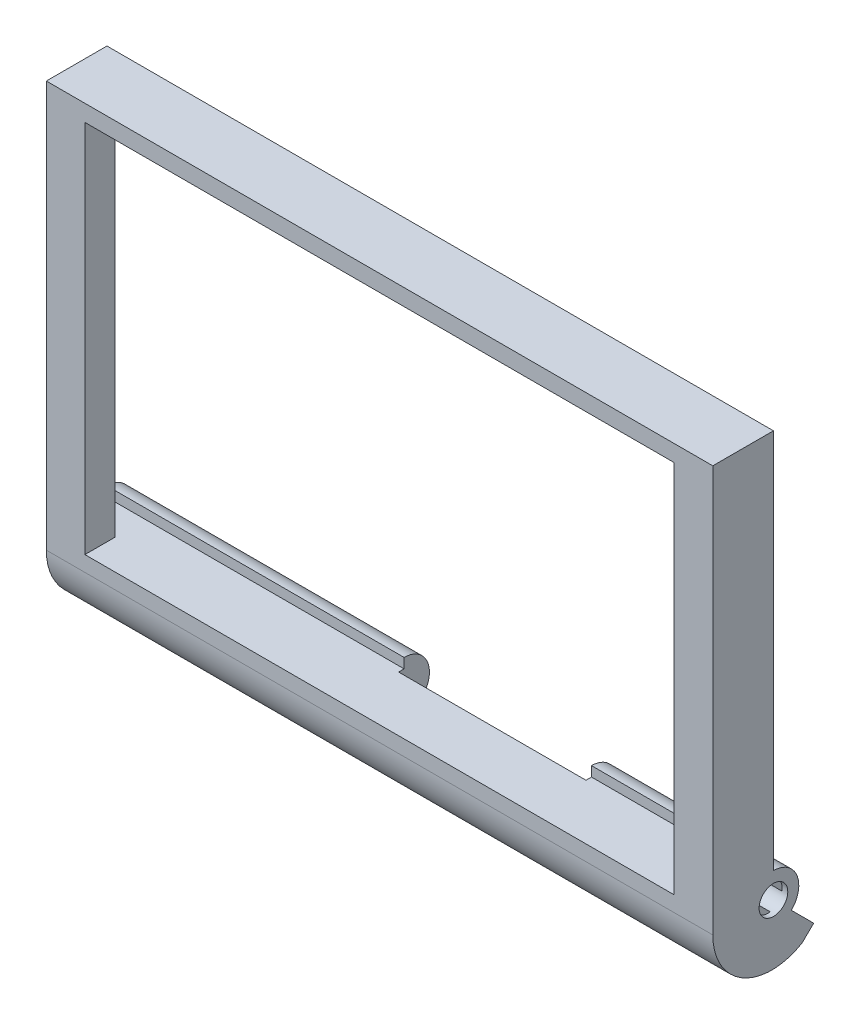
ISO-10303-21;
HEADER;
FILE_DESCRIPTION(('STEP AP214'),'2;1');
FILE_NAME('part.step','',(''),(''),'','','');
FILE_SCHEMA(('AUTOMOTIVE_DESIGN { 1 0 10303 214 1 1 1 1 }'));
ENDSEC;
DATA;
#1=APPLICATION_CONTEXT('core data for automotive mechanical design processes');
#2=APPLICATION_PROTOCOL_DEFINITION('international standard','automotive_design',2000,#1);
#3=PRODUCT_CONTEXT('',#1,'mechanical');
#4=PRODUCT('Part','Part','',(#3));
#5=PRODUCT_RELATED_PRODUCT_CATEGORY('part','',(#4));
#6=PRODUCT_DEFINITION_FORMATION('','',#4);
#7=PRODUCT_DEFINITION_CONTEXT('part definition',#1,'design');
#8=PRODUCT_DEFINITION('design','',#6,#7);
#9=PRODUCT_DEFINITION_SHAPE('','',#8);
#10=(LENGTH_UNIT() NAMED_UNIT(*) SI_UNIT(.MILLI.,.METRE.));
#11=(NAMED_UNIT(*) PLANE_ANGLE_UNIT() SI_UNIT($,.RADIAN.));
#12=(NAMED_UNIT(*) SI_UNIT($,.STERADIAN.) SOLID_ANGLE_UNIT());
#13=UNCERTAINTY_MEASURE_WITH_UNIT(LENGTH_MEASURE(1.E-05),#10,'distance_accuracy_value','');
#14=(GEOMETRIC_REPRESENTATION_CONTEXT(3) GLOBAL_UNCERTAINTY_ASSIGNED_CONTEXT((#13)) GLOBAL_UNIT_ASSIGNED_CONTEXT((#10,
#11,#12)) REPRESENTATION_CONTEXT('',''));
#15=CARTESIAN_POINT('',(0.,0.,0.));
#16=DIRECTION('',(0.,0.,1.));
#17=DIRECTION('',(1.,0.,0.));
#18=AXIS2_PLACEMENT_3D('',#15,#16,#17);
#19=CARTESIAN_POINT('',(73.4607647738325,-36.75,-9.));
#20=DIRECTION('',(-1.,0.,0.));
#21=DIRECTION('',(0.,-1.,0.));
#22=AXIS2_PLACEMENT_3D('',#19,#20,#21);
#23=CYLINDRICAL_SURFACE('',#22,4.6);
#24=CARTESIAN_POINT('',(27.45,-36.75,-9.));
#25=DIRECTION('',(1.,0.,0.));
#26=DIRECTION('',(0.,1.,0.));
#27=AXIS2_PLACEMENT_3D('',#24,#25,#26);
#28=CIRCLE('',#27,4.6);
#29=CARTESIAN_POINT('',(27.45,-32.15,-9.));
#30=VERTEX_POINT('',#29);
#31=CARTESIAN_POINT('',(27.45,-40.0026911934581,-12.2526911934581));
#32=VERTEX_POINT('',#31);
#33=EDGE_CURVE('E87',#30,#32,#28,.F.);
#34=ORIENTED_EDGE('',*,*,#33,.F.);
#35=DIRECTION('',(-1.,0.,0.));
#36=VECTOR('',#35,1.);
#37=CARTESIAN_POINT('',(73.4607647738325,-32.15,-9.));
#38=LINE('',#37,#36);
#39=CARTESIAN_POINT('',(59.15,-32.15,-9.));
#40=VERTEX_POINT('',#39);
#41=EDGE_CURVE('E441',#30,#40,#38,.F.);
#42=ORIENTED_EDGE('',*,*,#41,.T.);
#43=CARTESIAN_POINT('',(60.45,-32.15,-9.));
#44=VERTEX_POINT('',#43);
#45=EDGE_CURVE('E440',#40,#44,#38,.F.);
#46=ORIENTED_EDGE('',*,*,#45,.T.);
#47=CARTESIAN_POINT('',(60.45,-36.75,-9.));
#48=DIRECTION('',(-1.,0.,0.));
#49=DIRECTION('',(0.,-1.,0.));
#50=AXIS2_PLACEMENT_3D('',#47,#48,#49);
#51=CIRCLE('',#50,4.6);
#52=CARTESIAN_POINT('',(60.45,-40.0026911934581,-12.2526911934581));
#53=VERTEX_POINT('',#52);
#54=EDGE_CURVE('E437',#53,#44,#51,.F.);
#55=ORIENTED_EDGE('',*,*,#54,.F.);
#56=DIRECTION('',(-1.,0.,0.));
#57=VECTOR('',#56,1.);
#58=CARTESIAN_POINT('',(73.4607647738325,-40.0026911934581,-12.2526911934581));
#59=LINE('',#58,#57);
#60=EDGE_CURVE('E509',#53,#32,#59,.T.);
#61=ORIENTED_EDGE('',*,*,#60,.T.);
#62=EDGE_LOOP('',(#34,#42,#46,#55,#61));
#63=FACE_BOUND('',#62,.T.);
#64=ADVANCED_FACE('F78',(#63),#23,.T.);
#65=CARTESIAN_POINT('',(53.45,33.95,70.2598710810385));
#66=DIRECTION('',(1.,0.,0.));
#67=DIRECTION('',(0.,1.,0.));
#68=AXIS2_PLACEMENT_3D('',#65,#66,#67);
#69=PLANE('',#68);
#70=DIRECTION('',(0.,1.,0.));
#71=VECTOR('',#70,1.);
#72=CARTESIAN_POINT('',(53.45,33.95,-3.5));
#73=LINE('',#72,#71);
#74=CARTESIAN_POINT('',(53.45,-33.95,-3.5));
#75=VERTEX_POINT('',#74);
#76=CARTESIAN_POINT('',(53.45,33.95,-3.5));
#77=VERTEX_POINT('',#76);
#78=EDGE_CURVE('E353',#75,#77,#73,.T.);
#79=ORIENTED_EDGE('',*,*,#78,.F.);
#80=DIRECTION('',(0.,0.,-1.));
#81=VECTOR('',#80,1.);
#82=CARTESIAN_POINT('',(53.45,-33.95,70.2598710810385));
#83=LINE('',#82,#81);
#84=CARTESIAN_POINT('',(53.45,-33.9500000000013,2.00000000000002));
#85=VERTEX_POINT('',#84);
#86=EDGE_CURVE('E506',#85,#75,#83,.T.);
#87=ORIENTED_EDGE('',*,*,#86,.F.);
#88=DIRECTION('',(0.,-1.,0.));
#89=VECTOR('',#88,1.);
#90=CARTESIAN_POINT('',(53.45,33.95,1.99999999999999));
#91=LINE('',#90,#89);
#92=CARTESIAN_POINT('',(53.45,33.95,1.99999999999999));
#93=VERTEX_POINT('',#92);
#94=EDGE_CURVE('E102',#93,#85,#91,.T.);
#95=ORIENTED_EDGE('',*,*,#94,.F.);
#96=DIRECTION('',(0.,0.,-1.));
#97=VECTOR('',#96,1.);
#98=CARTESIAN_POINT('',(53.45,33.95,70.2598710810385));
#99=LINE('',#98,#97);
#100=EDGE_CURVE('E495',#93,#77,#99,.T.);
#101=ORIENTED_EDGE('',*,*,#100,.T.);
#102=EDGE_LOOP('',(#79,#87,#95,#101));
#103=FACE_BOUND('',#102,.T.);
#104=ADVANCED_FACE('F594',(#103),#69,.F.);
#105=CARTESIAN_POINT('',(-53.45,33.95,70.2598710810385));
#106=DIRECTION('',(-1.,0.,0.));
#107=DIRECTION('',(0.,-1.,0.));
#108=AXIS2_PLACEMENT_3D('',#105,#106,#107);
#109=PLANE('',#108);
#110=DIRECTION('',(0.,-1.,0.));
#111=VECTOR('',#110,1.);
#112=CARTESIAN_POINT('',(-53.45,33.95,-3.5));
#113=LINE('',#112,#111);
#114=CARTESIAN_POINT('',(-53.45,33.95,-3.5));
#115=VERTEX_POINT('',#114);
#116=CARTESIAN_POINT('',(-53.45,-33.95,-3.5));
#117=VERTEX_POINT('',#116);
#118=EDGE_CURVE('E351',#115,#117,#113,.T.);
#119=ORIENTED_EDGE('',*,*,#118,.F.);
#120=DIRECTION('',(0.,0.,-1.));
#121=VECTOR('',#120,1.);
#122=CARTESIAN_POINT('',(-53.45,33.95,70.2598710810385));
#123=LINE('',#122,#121);
#124=CARTESIAN_POINT('',(-53.45,33.95,1.99999999999999));
#125=VERTEX_POINT('',#124);
#126=EDGE_CURVE('E498',#125,#115,#123,.T.);
#127=ORIENTED_EDGE('',*,*,#126,.F.);
#128=DIRECTION('',(0.,1.,0.));
#129=VECTOR('',#128,1.);
#130=CARTESIAN_POINT('',(-53.45,33.95,1.99999999999999));
#131=LINE('',#130,#129);
#132=CARTESIAN_POINT('',(-53.45,-33.9500000000001,2.00000000000002));
#133=VERTEX_POINT('',#132);
#134=EDGE_CURVE('E492',#133,#125,#131,.T.);
#135=ORIENTED_EDGE('',*,*,#134,.F.);
#136=DIRECTION('',(0.,0.,-1.));
#137=VECTOR('',#136,1.);
#138=CARTESIAN_POINT('',(-53.45,-33.95,70.2598710810385));
#139=LINE('',#138,#137);
#140=EDGE_CURVE('E489',#133,#117,#139,.T.);
#141=ORIENTED_EDGE('',*,*,#140,.T.);
#142=EDGE_LOOP('',(#119,#127,#135,#141));
#143=FACE_BOUND('',#142,.T.);
#144=ADVANCED_FACE('F599',(#143),#109,.F.);
#145=CARTESIAN_POINT('',(-60.45,33.95,-125.437215115944));
#146=DIRECTION('',(0.,-1.,0.));
#147=DIRECTION('',(0.,0.,-1.));
#148=AXIS2_PLACEMENT_3D('',#145,#146,#147);
#149=PLANE('',#148);
#150=ORIENTED_EDGE('',*,*,#126,.T.);
#151=DIRECTION('',(1.,0.,0.));
#152=VECTOR('',#151,1.);
#153=CARTESIAN_POINT('',(-60.45,33.95,-3.5));
#154=LINE('',#153,#152);
#155=EDGE_CURVE('E348',#115,#77,#154,.T.);
#156=ORIENTED_EDGE('',*,*,#155,.T.);
#157=ORIENTED_EDGE('',*,*,#100,.F.);
#158=DIRECTION('',(1.,0.,0.));
#159=VECTOR('',#158,1.);
#160=CARTESIAN_POINT('',(53.45,33.9500000000001,1.99999999999999));
#161=LINE('',#160,#159);
#162=EDGE_CURVE('E301',#125,#93,#161,.T.);
#163=ORIENTED_EDGE('',*,*,#162,.F.);
#164=EDGE_LOOP('',(#150,#156,#157,#163));
#165=FACE_BOUND('',#164,.T.);
#166=ADVANCED_FACE('F611',(#165),#149,.T.);
#167=CARTESIAN_POINT('',(-6.54999999999999,-41.35,-9.));
#168=DIRECTION('',(0.,0.,1.));
#169=DIRECTION('',(1.,0.,0.));
#170=AXIS2_PLACEMENT_3D('',#167,#168,#169);
#171=PLANE('',#170);
#172=DIRECTION('',(0.,-1.,0.));
#173=VECTOR('',#172,1.);
#174=CARTESIAN_POINT('',(-6.54999999999999,-41.35,-9.));
#175=LINE('',#174,#173);
#176=CARTESIAN_POINT('',(-6.54999999999999,-40.0026911934581,-9.));
#177=VERTEX_POINT('',#176);
#178=CARTESIAN_POINT('',(-6.54999999999999,-41.35,-9.));
#179=VERTEX_POINT('',#178);
#180=EDGE_CURVE('E386',#177,#179,#175,.T.);
#181=ORIENTED_EDGE('',*,*,#180,.F.);
#182=DIRECTION('',(-1.,0.,0.));
#183=VECTOR('',#182,1.);
#184=CARTESIAN_POINT('',(-6.54999999999999,-40.0026911934581,-9.));
#185=LINE('',#184,#183);
#186=CARTESIAN_POINT('',(27.45,-40.0026911934581,-9.));
#187=VERTEX_POINT('',#186);
#188=EDGE_CURVE('E288',#187,#177,#185,.T.);
#189=ORIENTED_EDGE('',*,*,#188,.F.);
#190=DIRECTION('',(0.,-1.,0.));
#191=VECTOR('',#190,1.);
#192=CARTESIAN_POINT('',(27.45,-41.35,-9.));
#193=LINE('',#192,#191);
#194=CARTESIAN_POINT('',(27.45,-41.35,-9.));
#195=VERTEX_POINT('',#194);
#196=EDGE_CURVE('E392',#187,#195,#193,.T.);
#197=ORIENTED_EDGE('',*,*,#196,.T.);
#198=DIRECTION('',(1.,0.,0.));
#199=VECTOR('',#198,1.);
#200=CARTESIAN_POINT('',(-6.54999999999999,-41.35,-9.));
#201=LINE('',#200,#199);
#202=EDGE_CURVE('E389',#179,#195,#201,.T.);
#203=ORIENTED_EDGE('',*,*,#202,.F.);
#204=EDGE_LOOP('',(#181,#189,#197,#203));
#205=FACE_BOUND('',#204,.T.);
#206=ADVANCED_FACE('F578',(#205),#171,.F.);
#207=DIRECTION('',(-1.,0.,0.));
#208=VECTOR('',#207,1.);
#209=CARTESIAN_POINT('',(-59.15,-32.15,-9.));
#210=LINE('',#209,#208);
#211=CARTESIAN_POINT('',(-6.54999999999999,-32.15,-9.));
#212=VERTEX_POINT('',#211);
#213=CARTESIAN_POINT('',(-59.15,-32.15,-9.00000000000001));
#214=VERTEX_POINT('',#213);
#215=EDGE_CURVE('E357',#212,#214,#210,.T.);
#216=ORIENTED_EDGE('',*,*,#215,.F.);
#217=CARTESIAN_POINT('',(-6.54999999999999,-36.75,-9.));
#218=DIRECTION('',(1.,0.,0.));
#219=DIRECTION('',(0.,1.,0.));
#220=AXIS2_PLACEMENT_3D('',#217,#218,#219);
#221=CIRCLE('',#220,4.6);
#222=CARTESIAN_POINT('',(-6.54999999999999,-40.0026911934581,-12.2526911934581));
#223=VERTEX_POINT('',#222);
#224=EDGE_CURVE('E12',#212,#223,#221,.F.);
#225=ORIENTED_EDGE('',*,*,#224,.T.);
#226=CARTESIAN_POINT('',(-60.45,-40.0026911934581,-12.2526911934581));
#227=VERTEX_POINT('',#226);
#228=EDGE_CURVE('E504',#223,#227,#59,.T.);
#229=ORIENTED_EDGE('',*,*,#228,.T.);
#230=CARTESIAN_POINT('',(-60.45,-36.75,-9.));
#231=DIRECTION('',(-1.,0.,0.));
#232=DIRECTION('',(0.,-1.,0.));
#233=AXIS2_PLACEMENT_3D('',#230,#231,#232);
#234=CIRCLE('',#233,4.6);
#235=CARTESIAN_POINT('',(-60.45,-32.15,-9.));
#236=VERTEX_POINT('',#235);
#237=EDGE_CURVE('E434',#236,#227,#234,.T.);
#238=ORIENTED_EDGE('',*,*,#237,.F.);
#239=EDGE_CURVE('E444',#236,#214,#38,.F.);
#240=ORIENTED_EDGE('',*,*,#239,.T.);
#241=EDGE_LOOP('',(#216,#225,#229,#238,#240));
#242=FACE_BOUND('',#241,.T.);
#243=ADVANCED_FACE('F565',(#242),#23,.T.);
#244=CARTESIAN_POINT('',(59.45,-36.75,-9.));
#245=DIRECTION('',(1.,0.,0.));
#246=DIRECTION('',(0.,1.,0.));
#247=AXIS2_PLACEMENT_3D('',#244,#245,#246);
#248=PLANE('',#247);
#249=DIRECTION('',(0.,0.707106781186557,0.707106781186538));
#250=VECTOR('',#249,1.);
#251=CARTESIAN_POINT('',(59.45,-37.1606844889462,-11.5673601715651));
#252=LINE('',#251,#250);
#253=CARTESIAN_POINT('',(59.45,-37.1606844889462,-11.5673601715651));
#254=VERTEX_POINT('',#253);
#255=CARTESIAN_POINT('',(59.45,-34.1826398284348,-8.58931551105385));
#256=VERTEX_POINT('',#255);
#257=EDGE_CURVE('E401',#254,#256,#252,.T.);
#258=ORIENTED_EDGE('',*,*,#257,.F.);
#259=CARTESIAN_POINT('',(59.45,-36.75,-9.));
#260=DIRECTION('',(1.,0.,0.));
#261=DIRECTION('',(0.,1.,0.));
#262=AXIS2_PLACEMENT_3D('',#259,#260,#261);
#263=CIRCLE('',#262,2.6);
#264=EDGE_CURVE('E428',#254,#256,#263,.T.);
#265=ORIENTED_EDGE('',*,*,#264,.T.);
#266=EDGE_LOOP('',(#258,#265));
#267=FACE_BOUND('',#266,.T.);
#268=ADVANCED_FACE('F603',(#267),#248,.T.);
#269=CARTESIAN_POINT('',(60.45,33.95,70.2598710810385));
#270=DIRECTION('',(-1.,0.,0.));
#271=DIRECTION('',(0.,-1.,0.));
#272=AXIS2_PLACEMENT_3D('',#269,#270,#271);
#273=PLANE('',#272);
#274=DIRECTION('',(0.,1.,0.));
#275=VECTOR('',#274,1.);
#276=CARTESIAN_POINT('',(60.45,33.95,1.99999999999999));
#277=LINE('',#276,#275);
#278=CARTESIAN_POINT('',(60.45,-36.75,2.00000000000002));
#279=VERTEX_POINT('',#278);
#280=CARTESIAN_POINT('',(60.45,36.95,1.99999999999999));
#281=VERTEX_POINT('',#280);
#282=EDGE_CURVE('E502',#279,#281,#277,.T.);
#283=ORIENTED_EDGE('',*,*,#282,.F.);
#284=CARTESIAN_POINT('',(60.45,-36.75,-9.));
#285=DIRECTION('',(-1.,0.,0.));
#286=DIRECTION('',(0.,-1.,0.));
#287=AXIS2_PLACEMENT_3D('',#284,#285,#286);
#288=CIRCLE('',#287,11.);
#289=CARTESIAN_POINT('',(60.45,-44.528174593052,-1.22182540694793));
#290=VERTEX_POINT('',#289);
#291=EDGE_CURVE('E445',#290,#279,#288,.T.);
#292=ORIENTED_EDGE('',*,*,#291,.F.);
#293=CARTESIAN_POINT('',(60.45,-37.0358929294252,-8.71410707057482));
#294=DIRECTION('',(-1.,0.,0.));
#295=DIRECTION('',(0.,-1.,0.));
#296=AXIS2_PLACEMENT_3D('',#293,#294,#295);
#297=CIRCLE('',#296,10.5956863418203);
#298=CARTESIAN_POINT('',(60.45,-46.1084308663916,-14.1874629366358));
#299=VERTEX_POINT('',#298);
#300=EDGE_CURVE('E461',#299,#290,#297,.T.);
#301=ORIENTED_EDGE('',*,*,#300,.F.);
#302=CARTESIAN_POINT('',(60.45,36.3469874301247,64.0969874301244));
#303=DIRECTION('',(-1.,0.,0.));
#304=DIRECTION('',(0.,-1.,0.));
#305=AXIS2_PLACEMENT_3D('',#302,#303,#304);
#306=CIRCLE('',#305,113.698509997621);
#307=CARTESIAN_POINT('',(60.45,-44.05,-16.3));
#308=VERTEX_POINT('',#307);
#309=EDGE_CURVE('E454',#299,#308,#306,.F.);
#310=ORIENTED_EDGE('',*,*,#309,.T.);
#311=DIRECTION('',(0.,0.707106781186549,0.707106781186546));
#312=VECTOR('',#311,1.);
#313=CARTESIAN_POINT('',(60.45,-36.75,-9.));
#314=LINE('',#313,#312);
#315=EDGE_CURVE('E458',#308,#53,#314,.T.);
#316=ORIENTED_EDGE('',*,*,#315,.T.);
#317=ORIENTED_EDGE('',*,*,#54,.T.);
#318=DIRECTION('',(0.,-1.,0.));
#319=VECTOR('',#318,1.);
#320=CARTESIAN_POINT('',(60.45,0.,-9.));
#321=LINE('',#320,#319);
#322=CARTESIAN_POINT('',(60.45,36.95,-9.));
#323=VERTEX_POINT('',#322);
#324=EDGE_CURVE('E448',#323,#44,#321,.T.);
#325=ORIENTED_EDGE('',*,*,#324,.F.);
#326=DIRECTION('',(0.,0.,1.));
#327=VECTOR('',#326,1.);
#328=CARTESIAN_POINT('',(60.45,36.95,-125.437215115944));
#329=LINE('',#328,#327);
#330=EDGE_CURVE('E485',#323,#281,#329,.T.);
#331=ORIENTED_EDGE('',*,*,#330,.T.);
#332=EDGE_LOOP('',(#283,#292,#301,#310,#316,#317,#325,#331));
#333=FACE_BOUND('',#332,.T.);
#334=CARTESIAN_POINT('',(60.45,-36.75,-9.));
#335=DIRECTION('',(1.,0.,0.));
#336=DIRECTION('',(0.,1.,0.));
#337=AXIS2_PLACEMENT_3D('',#334,#335,#336);
#338=CIRCLE('',#337,2.6);
#339=CARTESIAN_POINT('',(60.45,-34.15,-9.));
#340=VERTEX_POINT('',#339);
#341=EDGE_CURVE('E423',#340,#340,#338,.T.);
#342=ORIENTED_EDGE('',*,*,#341,.F.);
#343=EDGE_LOOP('',(#342));
#344=FACE_BOUND('',#343,.T.);
#345=ADVANCED_FACE('F534',(#333,#344),#273,.F.);
#346=CARTESIAN_POINT('',(0.,0.,2.));
#347=DIRECTION('',(0.,0.,1.));
#348=DIRECTION('',(0.,-1.,0.));
#349=AXIS2_PLACEMENT_3D('',#346,#347,#348);
#350=PLANE('',#349);
#351=ORIENTED_EDGE('',*,*,#162,.T.);
#352=ORIENTED_EDGE('',*,*,#94,.T.);
#353=DIRECTION('',(-1.,0.,0.));
#354=VECTOR('',#353,1.);
#355=CARTESIAN_POINT('',(-53.45,-33.9500000000001,2.00000000000002));
#356=LINE('',#355,#354);
#357=EDGE_CURVE('E308',#85,#133,#356,.T.);
#358=ORIENTED_EDGE('',*,*,#357,.T.);
#359=ORIENTED_EDGE('',*,*,#134,.T.);
#360=EDGE_LOOP('',(#351,#352,#358,#359));
#361=FACE_BOUND('',#360,.T.);
#362=ORIENTED_EDGE('',*,*,#282,.T.);
#363=DIRECTION('',(-1.,0.,0.));
#364=VECTOR('',#363,1.);
#365=CARTESIAN_POINT('',(60.45,36.95,1.99999999999999));
#366=LINE('',#365,#364);
#367=CARTESIAN_POINT('',(-60.45,36.95,1.99999999999999));
#368=VERTEX_POINT('',#367);
#369=EDGE_CURVE('E305',#281,#368,#366,.T.);
#370=ORIENTED_EDGE('',*,*,#369,.T.);
#371=DIRECTION('',(0.,-1.,0.));
#372=VECTOR('',#371,1.);
#373=CARTESIAN_POINT('',(-60.45,33.95,1.99999999999999));
#374=LINE('',#373,#372);
#375=CARTESIAN_POINT('',(-60.45,-36.75,2.));
#376=VERTEX_POINT('',#375);
#377=EDGE_CURVE('E496',#368,#376,#374,.T.);
#378=ORIENTED_EDGE('',*,*,#377,.T.);
#379=DIRECTION('',(-1.,0.,0.));
#380=VECTOR('',#379,1.);
#381=CARTESIAN_POINT('',(81.74081415626,-36.75,2.));
#382=LINE('',#381,#380);
#383=EDGE_CURVE('E449',#279,#376,#382,.T.);
#384=ORIENTED_EDGE('',*,*,#383,.F.);
#385=EDGE_LOOP('',(#362,#370,#378,#384));
#386=FACE_BOUND('',#385,.T.);
#387=ADVANCED_FACE('F80',(#361,#386),#350,.T.);
#388=CARTESIAN_POINT('',(-60.45,33.95,70.2598710810385));
#389=DIRECTION('',(1.,0.,0.));
#390=DIRECTION('',(0.,1.,0.));
#391=AXIS2_PLACEMENT_3D('',#388,#389,#390);
#392=PLANE('',#391);
#393=CARTESIAN_POINT('',(-60.45,-36.75,-8.99999999999999));
#394=DIRECTION('',(-1.,0.,0.));
#395=DIRECTION('',(0.,-1.,0.));
#396=AXIS2_PLACEMENT_3D('',#393,#394,#395);
#397=CIRCLE('',#396,1.95);
#398=CARTESIAN_POINT('',(-60.45,-38.7,-8.99999999999999));
#399=VERTEX_POINT('',#398);
#400=EDGE_CURVE('E397',#399,#399,#397,.T.);
#401=ORIENTED_EDGE('',*,*,#400,.F.);
#402=EDGE_LOOP('',(#401));
#403=FACE_BOUND('',#402,.T.);
#404=DIRECTION('',(0.,1.,0.));
#405=VECTOR('',#404,1.);
#406=CARTESIAN_POINT('',(-60.45,0.,-9.));
#407=LINE('',#406,#405);
#408=CARTESIAN_POINT('',(-60.45,36.95,-9.));
#409=VERTEX_POINT('',#408);
#410=EDGE_CURVE('E480',#236,#409,#407,.T.);
#411=ORIENTED_EDGE('',*,*,#410,.F.);
#412=ORIENTED_EDGE('',*,*,#237,.T.);
#413=DIRECTION('',(0.,-0.707106781186549,-0.707106781186546));
#414=VECTOR('',#413,1.);
#415=CARTESIAN_POINT('',(-60.45,-36.75,-9.));
#416=LINE('',#415,#414);
#417=CARTESIAN_POINT('',(-60.45,-44.05,-16.3));
#418=VERTEX_POINT('',#417);
#419=EDGE_CURVE('E469',#227,#418,#416,.T.);
#420=ORIENTED_EDGE('',*,*,#419,.T.);
#421=CARTESIAN_POINT('',(-60.45,36.3469874301247,64.0969874301244));
#422=DIRECTION('',(-1.,0.,0.));
#423=DIRECTION('',(0.,-1.,0.));
#424=AXIS2_PLACEMENT_3D('',#421,#422,#423);
#425=CIRCLE('',#424,113.698509997621);
#426=CARTESIAN_POINT('',(-60.45,-46.1084308663916,-14.1874629366358));
#427=VERTEX_POINT('',#426);
#428=EDGE_CURVE('E463',#418,#427,#425,.T.);
#429=ORIENTED_EDGE('',*,*,#428,.T.);
#430=CARTESIAN_POINT('',(-60.45,-37.0358929294252,-8.71410707057482));
#431=DIRECTION('',(1.,0.,0.));
#432=DIRECTION('',(0.,1.,0.));
#433=AXIS2_PLACEMENT_3D('',#430,#431,#432);
#434=CIRCLE('',#433,10.5956863418203);
#435=CARTESIAN_POINT('',(-60.45,-44.528174593052,-1.22182540694793));
#436=VERTEX_POINT('',#435);
#437=EDGE_CURVE('E466',#436,#427,#434,.T.);
#438=ORIENTED_EDGE('',*,*,#437,.F.);
#439=CARTESIAN_POINT('',(-60.45,-36.75,-9.));
#440=DIRECTION('',(-1.,0.,0.));
#441=DIRECTION('',(0.,-1.,0.));
#442=AXIS2_PLACEMENT_3D('',#439,#440,#441);
#443=CIRCLE('',#442,11.);
#444=EDGE_CURVE('E450',#376,#436,#443,.F.);
#445=ORIENTED_EDGE('',*,*,#444,.F.);
#446=ORIENTED_EDGE('',*,*,#377,.F.);
#447=DIRECTION('',(0.,0.,1.));
#448=VECTOR('',#447,1.);
#449=CARTESIAN_POINT('',(-60.45,36.95,-125.437215115944));
#450=LINE('',#449,#448);
#451=EDGE_CURVE('E486',#409,#368,#450,.T.);
#452=ORIENTED_EDGE('',*,*,#451,.F.);
#453=EDGE_LOOP('',(#411,#412,#420,#429,#438,#445,#446,#452));
#454=FACE_BOUND('',#453,.T.);
#455=ADVANCED_FACE('F562',(#403,#454),#392,.F.);
#456=CARTESIAN_POINT('',(-60.45,36.95,-125.437215115944));
#457=DIRECTION('',(0.,1.,0.));
#458=DIRECTION('',(0.,0.,1.));
#459=AXIS2_PLACEMENT_3D('',#456,#457,#458);
#460=PLANE('',#459);
#461=ORIENTED_EDGE('',*,*,#330,.F.);
#462=DIRECTION('',(1.,0.,0.));
#463=VECTOR('',#462,1.);
#464=CARTESIAN_POINT('',(0.,36.95,-9.));
#465=LINE('',#464,#463);
#466=EDGE_CURVE('E482',#409,#323,#465,.T.);
#467=ORIENTED_EDGE('',*,*,#466,.F.);
#468=ORIENTED_EDGE('',*,*,#451,.T.);
#469=ORIENTED_EDGE('',*,*,#369,.F.);
#470=EDGE_LOOP('',(#461,#467,#468,#469));
#471=FACE_BOUND('',#470,.T.);
#472=ADVANCED_FACE('F544',(#471),#460,.T.);
#473=CARTESIAN_POINT('',(60.45,-33.95,-125.437215115944));
#474=DIRECTION('',(0.,1.,0.));
#475=DIRECTION('',(-1.,0.,0.));
#476=AXIS2_PLACEMENT_3D('',#473,#474,#475);
#477=PLANE('',#476);
#478=DIRECTION('',(0.,0.,-1.));
#479=VECTOR('',#478,1.);
#480=CARTESIAN_POINT('',(-6.54999999999999,-33.95,-8.));
#481=LINE('',#480,#479);
#482=CARTESIAN_POINT('',(-6.54999999999999,-33.95,-8.));
#483=VERTEX_POINT('',#482);
#484=CARTESIAN_POINT('',(-6.54999999999999,-33.95,-9.));
#485=VERTEX_POINT('',#484);
#486=EDGE_CURVE('E266',#483,#485,#481,.T.);
#487=ORIENTED_EDGE('',*,*,#486,.T.);
#488=DIRECTION('',(-1.,0.,0.));
#489=VECTOR('',#488,1.);
#490=CARTESIAN_POINT('',(59.15,-33.95,-9.00000000000001));
#491=LINE('',#490,#489);
#492=CARTESIAN_POINT('',(-59.15,-33.95,-9.00000000000001));
#493=VERTEX_POINT('',#492);
#494=EDGE_CURVE('E332',#485,#493,#491,.T.);
#495=ORIENTED_EDGE('',*,*,#494,.T.);
#496=DIRECTION('',(0.,0.,1.));
#497=VECTOR('',#496,1.);
#498=CARTESIAN_POINT('',(-59.15,-33.95,-145.550833025654));
#499=LINE('',#498,#497);
#500=CARTESIAN_POINT('',(-59.15,-33.95,-3.5));
#501=VERTEX_POINT('',#500);
#502=EDGE_CURVE('E335',#493,#501,#499,.T.);
#503=ORIENTED_EDGE('',*,*,#502,.T.);
#504=DIRECTION('',(-1.,0.,0.));
#505=VECTOR('',#504,1.);
#506=CARTESIAN_POINT('',(59.15,-33.95,-3.5));
#507=LINE('',#506,#505);
#508=EDGE_CURVE('E316',#117,#501,#507,.T.);
#509=ORIENTED_EDGE('',*,*,#508,.F.);
#510=ORIENTED_EDGE('',*,*,#140,.F.);
#511=ORIENTED_EDGE('',*,*,#357,.F.);
#512=ORIENTED_EDGE('',*,*,#86,.T.);
#513=CARTESIAN_POINT('',(59.15,-33.95,-3.5));
#514=VERTEX_POINT('',#513);
#515=EDGE_CURVE('E317',#514,#75,#507,.T.);
#516=ORIENTED_EDGE('',*,*,#515,.F.);
#517=DIRECTION('',(0.,0.,1.));
#518=VECTOR('',#517,1.);
#519=CARTESIAN_POINT('',(59.15,-33.95,-145.550833025654));
#520=LINE('',#519,#518);
#521=CARTESIAN_POINT('',(59.15,-33.95,-9.00000000000001));
#522=VERTEX_POINT('',#521);
#523=EDGE_CURVE('E326',#522,#514,#520,.T.);
#524=ORIENTED_EDGE('',*,*,#523,.F.);
#525=CARTESIAN_POINT('',(27.45,-33.95,-9.00000000000001));
#526=VERTEX_POINT('',#525);
#527=EDGE_CURVE('E330',#522,#526,#491,.T.);
#528=ORIENTED_EDGE('',*,*,#527,.T.);
#529=DIRECTION('',(0.,0.,-1.));
#530=VECTOR('',#529,1.);
#531=CARTESIAN_POINT('',(27.45,-33.95,-8.));
#532=LINE('',#531,#530);
#533=CARTESIAN_POINT('',(27.45,-33.95,-8.));
#534=VERTEX_POINT('',#533);
#535=EDGE_CURVE('E278',#534,#526,#532,.T.);
#536=ORIENTED_EDGE('',*,*,#535,.F.);
#537=DIRECTION('',(1.,0.,0.));
#538=VECTOR('',#537,1.);
#539=CARTESIAN_POINT('',(-6.54999999999999,-33.95,-8.));
#540=LINE('',#539,#538);
#541=EDGE_CURVE('E285',#483,#534,#540,.T.);
#542=ORIENTED_EDGE('',*,*,#541,.F.);
#543=EDGE_LOOP('',(#487,#495,#503,#509,#510,#511,#512,#516,#524,#528,#536,#542));
#544=FACE_BOUND('',#543,.T.);
#545=ADVANCED_FACE('F290',(#544),#477,.T.);
#546=CARTESIAN_POINT('',(0.,0.,-9.));
#547=DIRECTION('',(0.,0.,-1.));
#548=DIRECTION('',(-1.,0.,0.));
#549=AXIS2_PLACEMENT_3D('',#546,#547,#548);
#550=PLANE('',#549);
#551=DIRECTION('',(0.,-1.,0.));
#552=VECTOR('',#551,1.);
#553=CARTESIAN_POINT('',(59.15,-32.15,-9.));
#554=LINE('',#553,#552);
#555=CARTESIAN_POINT('',(59.15,34.25,-9.));
#556=VERTEX_POINT('',#555);
#557=EDGE_CURVE('E360',#556,#40,#554,.T.);
#558=ORIENTED_EDGE('',*,*,#557,.F.);
#559=DIRECTION('',(1.,0.,0.));
#560=VECTOR('',#559,1.);
#561=CARTESIAN_POINT('',(-59.15,34.25,-9.));
#562=LINE('',#561,#560);
#563=CARTESIAN_POINT('',(-59.15,34.25,-9.));
#564=VERTEX_POINT('',#563);
#565=EDGE_CURVE('E363',#564,#556,#562,.T.);
#566=ORIENTED_EDGE('',*,*,#565,.F.);
#567=DIRECTION('',(0.,1.,0.));
#568=VECTOR('',#567,1.);
#569=CARTESIAN_POINT('',(-59.15,-32.15,-9.));
#570=LINE('',#569,#568);
#571=EDGE_CURVE('E356',#214,#564,#570,.T.);
#572=ORIENTED_EDGE('',*,*,#571,.F.);
#573=ORIENTED_EDGE('',*,*,#239,.F.);
#574=ORIENTED_EDGE('',*,*,#410,.T.);
#575=ORIENTED_EDGE('',*,*,#466,.T.);
#576=ORIENTED_EDGE('',*,*,#324,.T.);
#577=ORIENTED_EDGE('',*,*,#45,.F.);
#578=EDGE_LOOP('',(#558,#566,#572,#573,#574,#575,#576,#577));
#579=FACE_BOUND('',#578,.T.);
#580=ADVANCED_FACE('F538',(#579),#550,.T.);
#581=CARTESIAN_POINT('',(81.74081415626,-36.75,-9.));
#582=DIRECTION('',(-1.,0.,0.));
#583=DIRECTION('',(0.,-1.,0.));
#584=AXIS2_PLACEMENT_3D('',#581,#582,#583);
#585=CYLINDRICAL_SURFACE('',#584,11.);
#586=DIRECTION('',(-1.,0.,0.));
#587=VECTOR('',#586,1.);
#588=CARTESIAN_POINT('',(81.74081415626,-44.528174593052,-1.22182540694793));
#589=LINE('',#588,#587);
#590=EDGE_CURVE('E453',#290,#436,#589,.T.);
#591=ORIENTED_EDGE('',*,*,#590,.F.);
#592=ORIENTED_EDGE('',*,*,#291,.T.);
#593=ORIENTED_EDGE('',*,*,#383,.T.);
#594=ORIENTED_EDGE('',*,*,#444,.T.);
#595=EDGE_LOOP('',(#591,#592,#593,#594));
#596=FACE_BOUND('',#595,.T.);
#597=ADVANCED_FACE('F551',(#596),#585,.T.);
#598=CARTESIAN_POINT('',(81.74081415626,-36.75,-9.));
#599=DIRECTION('',(0.,0.707106781186546,-0.707106781186549));
#600=DIRECTION('',(0.,0.707106781186549,0.707106781186546));
#601=AXIS2_PLACEMENT_3D('',#598,#599,#600);
#602=PLANE('',#601);
#603=ORIENTED_EDGE('',*,*,#60,.F.);
#604=ORIENTED_EDGE('',*,*,#315,.F.);
#605=DIRECTION('',(-1.,0.,0.));
#606=VECTOR('',#605,1.);
#607=CARTESIAN_POINT('',(81.74081415626,-44.05,-16.3));
#608=LINE('',#607,#606);
#609=EDGE_CURVE('E472',#308,#418,#608,.T.);
#610=ORIENTED_EDGE('',*,*,#609,.T.);
#611=ORIENTED_EDGE('',*,*,#419,.F.);
#612=ORIENTED_EDGE('',*,*,#228,.F.);
#613=EDGE_CURVE('E512',#32,#223,#59,.T.);
#614=ORIENTED_EDGE('',*,*,#613,.F.);
#615=EDGE_LOOP('',(#603,#604,#610,#611,#612,#614));
#616=FACE_BOUND('',#615,.T.);
#617=ADVANCED_FACE('F528',(#616),#602,.T.);
#618=CARTESIAN_POINT('',(81.7408141562599,36.3469874301247,64.0969874301244));
#619=DIRECTION('',(-1.,0.,0.));
#620=DIRECTION('',(0.,-1.,0.));
#621=AXIS2_PLACEMENT_3D('',#618,#619,#620);
#622=CYLINDRICAL_SURFACE('',#621,113.698509997621);
#623=ORIENTED_EDGE('',*,*,#309,.F.);
#624=DIRECTION('',(-1.,0.,0.));
#625=VECTOR('',#624,1.);
#626=CARTESIAN_POINT('',(81.74081415626,-46.1084308663916,-14.1874629366358));
#627=LINE('',#626,#625);
#628=EDGE_CURVE('E471',#299,#427,#627,.T.);
#629=ORIENTED_EDGE('',*,*,#628,.T.);
#630=ORIENTED_EDGE('',*,*,#428,.F.);
#631=ORIENTED_EDGE('',*,*,#609,.F.);
#632=EDGE_LOOP('',(#623,#629,#630,#631));
#633=FACE_BOUND('',#632,.T.);
#634=ADVANCED_FACE('F559',(#633),#622,.T.);
#635=CARTESIAN_POINT('',(81.74081415626,-37.0358929294252,-8.71410707057482));
#636=DIRECTION('',(-1.,0.,0.));
#637=DIRECTION('',(0.,-1.,0.));
#638=AXIS2_PLACEMENT_3D('',#635,#636,#637);
#639=CYLINDRICAL_SURFACE('',#638,10.5956863418203);
#640=ORIENTED_EDGE('',*,*,#628,.F.);
#641=ORIENTED_EDGE('',*,*,#300,.T.);
#642=ORIENTED_EDGE('',*,*,#590,.T.);
#643=ORIENTED_EDGE('',*,*,#437,.T.);
#644=EDGE_LOOP('',(#640,#641,#642,#643));
#645=FACE_BOUND('',#644,.T.);
#646=ADVANCED_FACE('F555',(#645),#639,.T.);
#647=CARTESIAN_POINT('',(59.45,-36.75,-9.));
#648=DIRECTION('',(1.,0.,0.));
#649=DIRECTION('',(0.,1.,0.));
#650=AXIS2_PLACEMENT_3D('',#647,#648,#649);
#651=CYLINDRICAL_SURFACE('',#650,2.6);
#652=CARTESIAN_POINT('',(59.45,-36.3393155110538,-6.43263982843486));
#653=VERTEX_POINT('',#652);
#654=CARTESIAN_POINT('',(59.45,-39.3173601715651,-9.41068448894615));
#655=VERTEX_POINT('',#654);
#656=EDGE_CURVE('E431',#653,#655,#263,.T.);
#657=ORIENTED_EDGE('',*,*,#656,.F.);
#658=DIRECTION('',(1.,0.,0.));
#659=VECTOR('',#658,1.);
#660=CARTESIAN_POINT('',(53.35,-36.3393155110538,-6.43263982843485));
#661=LINE('',#660,#659);
#662=CARTESIAN_POINT('',(53.35,-36.3393155110538,-6.43263982843485));
#663=VERTEX_POINT('',#662);
#664=EDGE_CURVE('E94',#663,#653,#661,.T.);
#665=ORIENTED_EDGE('',*,*,#664,.F.);
#666=CARTESIAN_POINT('',(53.35,-36.75,-9.));
#667=DIRECTION('',(1.,0.,0.));
#668=DIRECTION('',(0.,1.,0.));
#669=AXIS2_PLACEMENT_3D('',#666,#667,#668);
#670=CIRCLE('',#669,2.6);
#671=CARTESIAN_POINT('',(53.35,-34.1826398284348,-8.58931551105385));
#672=VERTEX_POINT('',#671);
#673=EDGE_CURVE('E411',#672,#663,#670,.T.);
#674=ORIENTED_EDGE('',*,*,#673,.F.);
#675=DIRECTION('',(1.,0.,0.));
#676=VECTOR('',#675,1.);
#677=CARTESIAN_POINT('',(53.35,-34.1826398284348,-8.58931551105385));
#678=LINE('',#677,#676);
#679=EDGE_CURVE('E425',#672,#256,#678,.T.);
#680=ORIENTED_EDGE('',*,*,#679,.T.);
#681=ORIENTED_EDGE('',*,*,#264,.F.);
#682=DIRECTION('',(1.,0.,0.));
#683=VECTOR('',#682,1.);
#684=CARTESIAN_POINT('',(53.35,-37.1606844889462,-11.5673601715651));
#685=LINE('',#684,#683);
#686=CARTESIAN_POINT('',(53.35,-37.1606844889462,-11.5673601715651));
#687=VERTEX_POINT('',#686);
#688=EDGE_CURVE('E417',#687,#254,#685,.T.);
#689=ORIENTED_EDGE('',*,*,#688,.F.);
#690=CARTESIAN_POINT('',(53.35,-36.75,-9.));
#691=DIRECTION('',(1.,0.,0.));
#692=DIRECTION('',(0.,1.,0.));
#693=AXIS2_PLACEMENT_3D('',#690,#691,#692);
#694=CIRCLE('',#693,2.59999999999999);
#695=CARTESIAN_POINT('',(53.35,-39.3173601715651,-9.41068448894615));
#696=VERTEX_POINT('',#695);
#697=EDGE_CURVE('E404',#696,#687,#694,.T.);
#698=ORIENTED_EDGE('',*,*,#697,.F.);
#699=DIRECTION('',(1.,0.,0.));
#700=VECTOR('',#699,1.);
#701=CARTESIAN_POINT('',(53.35,-39.3173601715651,-9.41068448894615));
#702=LINE('',#701,#700);
#703=EDGE_CURVE('E421',#696,#655,#702,.T.);
#704=ORIENTED_EDGE('',*,*,#703,.T.);
#705=EDGE_LOOP('',(#657,#665,#674,#680,#681,#689,#698,#704));
#706=FACE_BOUND('',#705,.T.);
#707=ORIENTED_EDGE('',*,*,#341,.T.);
#708=EDGE_LOOP('',(#707));
#709=FACE_BOUND('',#708,.T.);
#710=ADVANCED_FACE('F642',(#706,#709),#651,.F.);
#711=DIRECTION('',(0.,-0.707106781186554,-0.707106781186541));
#712=VECTOR('',#711,1.);
#713=CARTESIAN_POINT('',(59.45,-39.3173601715651,-9.41068448894615));
#714=LINE('',#713,#712);
#715=EDGE_CURVE('E408',#653,#655,#714,.T.);
#716=ORIENTED_EDGE('',*,*,#715,.F.);
#717=ORIENTED_EDGE('',*,*,#656,.T.);
#718=EDGE_LOOP('',(#716,#717));
#719=FACE_BOUND('',#718,.T.);
#720=ADVANCED_FACE('F610',(#719),#248,.T.);
#721=CARTESIAN_POINT('',(53.35,-39.3173601715651,-9.41068448894615));
#722=DIRECTION('',(0.,-0.707106781186541,0.707106781186554));
#723=DIRECTION('',(0.,-0.707106781186554,-0.707106781186541));
#724=AXIS2_PLACEMENT_3D('',#721,#722,#723);
#725=PLANE('',#724);
#726=ORIENTED_EDGE('',*,*,#715,.T.);
#727=ORIENTED_EDGE('',*,*,#703,.F.);
#728=DIRECTION('',(0.,-0.707106781186554,-0.707106781186541));
#729=VECTOR('',#728,1.);
#730=CARTESIAN_POINT('',(53.35,-39.3173601715651,-9.41068448894615));
#731=LINE('',#730,#729);
#732=EDGE_CURVE('E414',#663,#696,#731,.T.);
#733=ORIENTED_EDGE('',*,*,#732,.F.);
#734=ORIENTED_EDGE('',*,*,#664,.T.);
#735=EDGE_LOOP('',(#726,#727,#733,#734));
#736=FACE_BOUND('',#735,.T.);
#737=ADVANCED_FACE('F636',(#736),#725,.F.);
#738=CARTESIAN_POINT('',(53.35,-37.1606844889462,-11.5673601715651));
#739=DIRECTION('',(0.,0.707106781186538,-0.707106781186557));
#740=DIRECTION('',(0.,0.707106781186557,0.707106781186538));
#741=AXIS2_PLACEMENT_3D('',#738,#739,#740);
#742=PLANE('',#741);
#743=ORIENTED_EDGE('',*,*,#257,.T.);
#744=ORIENTED_EDGE('',*,*,#679,.F.);
#745=DIRECTION('',(0.,0.707106781186557,0.707106781186538));
#746=VECTOR('',#745,1.);
#747=CARTESIAN_POINT('',(53.35,-37.1606844889462,-11.5673601715651));
#748=LINE('',#747,#746);
#749=EDGE_CURVE('E407',#687,#672,#748,.T.);
#750=ORIENTED_EDGE('',*,*,#749,.F.);
#751=ORIENTED_EDGE('',*,*,#688,.T.);
#752=EDGE_LOOP('',(#743,#744,#750,#751));
#753=FACE_BOUND('',#752,.T.);
#754=ADVANCED_FACE('F634',(#753),#742,.F.);
#755=CARTESIAN_POINT('',(53.35,-36.75,-9.));
#756=DIRECTION('',(1.,0.,0.));
#757=DIRECTION('',(0.,1.,0.));
#758=AXIS2_PLACEMENT_3D('',#755,#756,#757);
#759=PLANE('',#758);
#760=ORIENTED_EDGE('',*,*,#697,.T.);
#761=ORIENTED_EDGE('',*,*,#749,.T.);
#762=ORIENTED_EDGE('',*,*,#673,.T.);
#763=ORIENTED_EDGE('',*,*,#732,.T.);
#764=EDGE_LOOP('',(#760,#761,#762,#763));
#765=FACE_BOUND('',#764,.T.);
#766=ADVANCED_FACE('F630',(#765),#759,.T.);
#767=CARTESIAN_POINT('',(-56.45,-36.75,-8.99999999999999));
#768=DIRECTION('',(-1.,0.,0.));
#769=DIRECTION('',(0.,-1.,0.));
#770=AXIS2_PLACEMENT_3D('',#767,#768,#769);
#771=CYLINDRICAL_SURFACE('',#770,1.95);
#772=CARTESIAN_POINT('',(-56.45,-36.75,-8.99999999999999));
#773=DIRECTION('',(-1.,0.,0.));
#774=DIRECTION('',(0.,-1.,0.));
#775=AXIS2_PLACEMENT_3D('',#772,#773,#774);
#776=CIRCLE('',#775,1.95);
#777=CARTESIAN_POINT('',(-56.45,-38.7,-8.99999999999999));
#778=VERTEX_POINT('',#777);
#779=EDGE_CURVE('E398',#778,#778,#776,.T.);
#780=ORIENTED_EDGE('',*,*,#779,.F.);
#781=EDGE_LOOP('',(#780));
#782=FACE_BOUND('',#781,.T.);
#783=ORIENTED_EDGE('',*,*,#400,.T.);
#784=EDGE_LOOP('',(#783));
#785=FACE_BOUND('',#784,.T.);
#786=ADVANCED_FACE('F626',(#782,#785),#771,.F.);
#787=CARTESIAN_POINT('',(-56.45,-36.75,-8.99999999999999));
#788=DIRECTION('',(-1.,0.,0.));
#789=DIRECTION('',(0.,-1.,0.));
#790=AXIS2_PLACEMENT_3D('',#787,#788,#789);
#791=PLANE('',#790);
#792=ORIENTED_EDGE('',*,*,#779,.T.);
#793=EDGE_LOOP('',(#792));
#794=FACE_BOUND('',#793,.T.);
#795=ADVANCED_FACE('F623',(#794),#791,.T.);
#796=CARTESIAN_POINT('',(-6.54999999999999,-36.75,-9.));
#797=DIRECTION('',(1.,0.,0.));
#798=DIRECTION('',(0.,1.,0.));
#799=AXIS2_PLACEMENT_3D('',#796,#797,#798);
#800=CYLINDRICAL_SURFACE('',#799,4.6);
#801=ORIENTED_EDGE('',*,*,#613,.T.);
#802=CARTESIAN_POINT('',(-6.54999999999999,-36.75,-9.));
#803=DIRECTION('',(1.,0.,0.));
#804=DIRECTION('',(0.,1.,0.));
#805=AXIS2_PLACEMENT_3D('',#802,#803,#804);
#806=CIRCLE('',#805,4.6);
#807=EDGE_CURVE('E384',#179,#223,#806,.T.);
#808=ORIENTED_EDGE('',*,*,#807,.F.);
#809=ORIENTED_EDGE('',*,*,#202,.T.);
#810=CARTESIAN_POINT('',(27.45,-36.75,-9.));
#811=DIRECTION('',(1.,0.,0.));
#812=DIRECTION('',(0.,1.,0.));
#813=AXIS2_PLACEMENT_3D('',#810,#811,#812);
#814=CIRCLE('',#813,4.6);
#815=EDGE_CURVE('E383',#195,#32,#814,.T.);
#816=ORIENTED_EDGE('',*,*,#815,.T.);
#817=EDGE_LOOP('',(#801,#808,#809,#816));
#818=FACE_BOUND('',#817,.T.);
#819=ADVANCED_FACE('F522',(#818),#800,.F.);
#820=CARTESIAN_POINT('',(-6.54999999999999,-36.75,-9.));
#821=DIRECTION('',(1.,0.,0.));
#822=DIRECTION('',(0.,1.,0.));
#823=AXIS2_PLACEMENT_3D('',#820,#821,#822);
#824=PLANE('',#823);
#825=ORIENTED_EDGE('',*,*,#807,.T.);
#826=ORIENTED_EDGE('',*,*,#224,.F.);
#827=EDGE_CURVE('E274',#212,#485,#175,.T.);
#828=ORIENTED_EDGE('',*,*,#827,.T.);
#829=ORIENTED_EDGE('',*,*,#486,.F.);
#830=DIRECTION('',(0.,1.,0.));
#831=VECTOR('',#830,1.);
#832=CARTESIAN_POINT('',(-6.54999999999999,-40.0026911934581,-8.));
#833=LINE('',#832,#831);
#834=CARTESIAN_POINT('',(-6.54999999999999,-40.0026911934581,-8.));
#835=VERTEX_POINT('',#834);
#836=EDGE_CURVE('E270',#835,#483,#833,.T.);
#837=ORIENTED_EDGE('',*,*,#836,.F.);
#838=DIRECTION('',(0.,0.,-1.));
#839=VECTOR('',#838,1.);
#840=CARTESIAN_POINT('',(-6.54999999999999,-40.0026911934581,-8.));
#841=LINE('',#840,#839);
#842=EDGE_CURVE('E299',#835,#177,#841,.T.);
#843=ORIENTED_EDGE('',*,*,#842,.T.);
#844=ORIENTED_EDGE('',*,*,#180,.T.);
#845=EDGE_LOOP('',(#825,#826,#828,#829,#837,#843,#844));
#846=FACE_BOUND('',#845,.T.);
#847=ADVANCED_FACE('F269',(#846),#824,.T.);
#848=CARTESIAN_POINT('',(27.45,-36.75,-9.));
#849=DIRECTION('',(1.,0.,0.));
#850=DIRECTION('',(0.,1.,0.));
#851=AXIS2_PLACEMENT_3D('',#848,#849,#850);
#852=PLANE('',#851);
#853=ORIENTED_EDGE('',*,*,#815,.F.);
#854=ORIENTED_EDGE('',*,*,#196,.F.);
#855=DIRECTION('',(0.,0.,-1.));
#856=VECTOR('',#855,1.);
#857=CARTESIAN_POINT('',(27.45,-40.0026911934581,-8.));
#858=LINE('',#857,#856);
#859=CARTESIAN_POINT('',(27.45,-40.0026911934581,-8.));
#860=VERTEX_POINT('',#859);
#861=EDGE_CURVE('E302',#860,#187,#858,.T.);
#862=ORIENTED_EDGE('',*,*,#861,.F.);
#863=DIRECTION('',(0.,-1.,0.));
#864=VECTOR('',#863,1.);
#865=CARTESIAN_POINT('',(27.45,-40.0026911934581,-8.));
#866=LINE('',#865,#864);
#867=EDGE_CURVE('E292',#534,#860,#866,.T.);
#868=ORIENTED_EDGE('',*,*,#867,.F.);
#869=ORIENTED_EDGE('',*,*,#535,.T.);
#870=EDGE_CURVE('E387',#30,#526,#193,.T.);
#871=ORIENTED_EDGE('',*,*,#870,.F.);
#872=ORIENTED_EDGE('',*,*,#33,.T.);
#873=EDGE_LOOP('',(#853,#854,#862,#868,#869,#871,#872));
#874=FACE_BOUND('',#873,.T.);
#875=ADVANCED_FACE('F517',(#874),#852,.F.);
#876=CARTESIAN_POINT('',(-59.15,34.25,131.16079020852));
#877=DIRECTION('',(0.,1.,0.));
#878=DIRECTION('',(-1.,0.,0.));
#879=AXIS2_PLACEMENT_3D('',#876,#877,#878);
#880=PLANE('',#879);
#881=DIRECTION('',(0.,0.,-1.));
#882=VECTOR('',#881,1.);
#883=CARTESIAN_POINT('',(-59.15,34.25,131.16079020852));
#884=LINE('',#883,#882);
#885=CARTESIAN_POINT('',(-59.15,34.25,-3.5));
#886=VERTEX_POINT('',#885);
#887=EDGE_CURVE('E369',#886,#564,#884,.T.);
#888=ORIENTED_EDGE('',*,*,#887,.T.);
#889=ORIENTED_EDGE('',*,*,#565,.T.);
#890=DIRECTION('',(0.,0.,-1.));
#891=VECTOR('',#890,1.);
#892=CARTESIAN_POINT('',(59.15,34.25,131.16079020852));
#893=LINE('',#892,#891);
#894=CARTESIAN_POINT('',(59.15,34.25,-3.5));
#895=VERTEX_POINT('',#894);
#896=EDGE_CURVE('E359',#895,#556,#893,.T.);
#897=ORIENTED_EDGE('',*,*,#896,.F.);
#898=DIRECTION('',(1.,0.,0.));
#899=VECTOR('',#898,1.);
#900=CARTESIAN_POINT('',(59.15,34.25,-3.5));
#901=LINE('',#900,#899);
#902=EDGE_CURVE('E323',#886,#895,#901,.T.);
#903=ORIENTED_EDGE('',*,*,#902,.F.);
#904=EDGE_LOOP('',(#888,#889,#897,#903));
#905=FACE_BOUND('',#904,.T.);
#906=ADVANCED_FACE('F763',(#905),#880,.F.);
#907=CARTESIAN_POINT('',(59.15,-32.15,131.16079020852));
#908=DIRECTION('',(1.,0.,0.));
#909=DIRECTION('',(0.,1.,0.));
#910=AXIS2_PLACEMENT_3D('',#907,#908,#909);
#911=PLANE('',#910);
#912=ORIENTED_EDGE('',*,*,#896,.T.);
#913=ORIENTED_EDGE('',*,*,#557,.T.);
#914=DIRECTION('',(0.,-1.,0.));
#915=VECTOR('',#914,1.);
#916=CARTESIAN_POINT('',(59.15,34.25,-9.00000000000001));
#917=LINE('',#916,#915);
#918=EDGE_CURVE('E333',#40,#522,#917,.T.);
#919=ORIENTED_EDGE('',*,*,#918,.T.);
#920=ORIENTED_EDGE('',*,*,#523,.T.);
#921=DIRECTION('',(0.,-1.,0.));
#922=VECTOR('',#921,1.);
#923=CARTESIAN_POINT('',(59.15,34.25,-3.5));
#924=LINE('',#923,#922);
#925=EDGE_CURVE('E313',#895,#514,#924,.T.);
#926=ORIENTED_EDGE('',*,*,#925,.F.);
#927=EDGE_LOOP('',(#912,#913,#919,#920,#926));
#928=FACE_BOUND('',#927,.T.);
#929=ADVANCED_FACE('F770',(#928),#911,.F.);
#930=CARTESIAN_POINT('',(-59.15,-32.15,131.16079020852));
#931=DIRECTION('',(-1.,0.,0.));
#932=DIRECTION('',(0.,-1.,0.));
#933=AXIS2_PLACEMENT_3D('',#930,#931,#932);
#934=PLANE('',#933);
#935=ORIENTED_EDGE('',*,*,#887,.F.);
#936=DIRECTION('',(0.,1.,0.));
#937=VECTOR('',#936,1.);
#938=CARTESIAN_POINT('',(-59.15,34.25,-3.5));
#939=LINE('',#938,#937);
#940=EDGE_CURVE('E320',#501,#886,#939,.T.);
#941=ORIENTED_EDGE('',*,*,#940,.F.);
#942=ORIENTED_EDGE('',*,*,#502,.F.);
#943=DIRECTION('',(0.,1.,0.));
#944=VECTOR('',#943,1.);
#945=CARTESIAN_POINT('',(-59.15,34.25,-9.00000000000001));
#946=LINE('',#945,#944);
#947=EDGE_CURVE('E327',#493,#214,#946,.T.);
#948=ORIENTED_EDGE('',*,*,#947,.T.);
#949=ORIENTED_EDGE('',*,*,#571,.T.);
#950=EDGE_LOOP('',(#935,#941,#942,#948,#949));
#951=FACE_BOUND('',#950,.T.);
#952=ADVANCED_FACE('F569',(#951),#934,.F.);
#953=CARTESIAN_POINT('',(0.,0.,-3.5));
#954=DIRECTION('',(0.,0.,-1.));
#955=DIRECTION('',(-1.,0.,0.));
#956=AXIS2_PLACEMENT_3D('',#953,#954,#955);
#957=PLANE('',#956);
#958=CARTESIAN_POINT('',(-56.5,-29.4999999999999,-3.5));
#959=DIRECTION('',(0.,0.,-1.));
#960=DIRECTION('',(-1.,0.,0.));
#961=AXIS2_PLACEMENT_3D('',#958,#959,#960);
#962=CIRCLE('',#961,1.5);
#963=CARTESIAN_POINT('',(-58.,-29.4999999999999,-3.5));
#964=VERTEX_POINT('',#963);
#965=EDGE_CURVE('E345',#964,#964,#962,.F.);
#966=ORIENTED_EDGE('',*,*,#965,.T.);
#967=EDGE_LOOP('',(#966));
#968=FACE_BOUND('',#967,.T.);
#969=CARTESIAN_POINT('',(-56.5,25.9000000000001,-3.5));
#970=DIRECTION('',(0.,0.,-1.));
#971=DIRECTION('',(-1.,0.,0.));
#972=AXIS2_PLACEMENT_3D('',#969,#970,#971);
#973=CIRCLE('',#972,1.5);
#974=CARTESIAN_POINT('',(-58.,25.9000000000001,-3.5));
#975=VERTEX_POINT('',#974);
#976=EDGE_CURVE('E342',#975,#975,#973,.F.);
#977=ORIENTED_EDGE('',*,*,#976,.T.);
#978=EDGE_LOOP('',(#977));
#979=FACE_BOUND('',#978,.T.);
#980=CARTESIAN_POINT('',(56.5,25.9000000000001,-3.5));
#981=DIRECTION('',(0.,0.,-1.));
#982=DIRECTION('',(-1.,0.,0.));
#983=AXIS2_PLACEMENT_3D('',#980,#981,#982);
#984=CIRCLE('',#983,1.5);
#985=CARTESIAN_POINT('',(55.,25.9000000000001,-3.5));
#986=VERTEX_POINT('',#985);
#987=EDGE_CURVE('E339',#986,#986,#984,.F.);
#988=ORIENTED_EDGE('',*,*,#987,.T.);
#989=EDGE_LOOP('',(#988));
#990=FACE_BOUND('',#989,.T.);
#991=CARTESIAN_POINT('',(56.5,-29.4999999999999,-3.5));
#992=DIRECTION('',(0.,0.,-1.));
#993=DIRECTION('',(-1.,0.,0.));
#994=AXIS2_PLACEMENT_3D('',#991,#992,#993);
#995=CIRCLE('',#994,1.5);
#996=CARTESIAN_POINT('',(55.,-29.4999999999999,-3.5));
#997=VERTEX_POINT('',#996);
#998=EDGE_CURVE('E82',#997,#997,#995,.F.);
#999=ORIENTED_EDGE('',*,*,#998,.T.);
#1000=EDGE_LOOP('',(#999));
#1001=FACE_BOUND('',#1000,.T.);
#1002=ORIENTED_EDGE('',*,*,#78,.T.);
#1003=ORIENTED_EDGE('',*,*,#155,.F.);
#1004=ORIENTED_EDGE('',*,*,#118,.T.);
#1005=ORIENTED_EDGE('',*,*,#508,.T.);
#1006=ORIENTED_EDGE('',*,*,#940,.T.);
#1007=ORIENTED_EDGE('',*,*,#902,.T.);
#1008=ORIENTED_EDGE('',*,*,#925,.T.);
#1009=ORIENTED_EDGE('',*,*,#515,.T.);
#1010=EDGE_LOOP('',(#1002,#1003,#1004,#1005,#1006,#1007,#1008,#1009));
#1011=FACE_BOUND('',#1010,.T.);
#1012=ADVANCED_FACE('F785',(#968,#979,#990,#1001,#1011),#957,.T.);
#1013=CARTESIAN_POINT('',(0.,0.,-9.));
#1014=DIRECTION('',(0.,0.,-1.));
#1015=DIRECTION('',(-1.,0.,0.));
#1016=AXIS2_PLACEMENT_3D('',#1013,#1014,#1015);
#1017=PLANE('',#1016);
#1018=ORIENTED_EDGE('',*,*,#527,.F.);
#1019=ORIENTED_EDGE('',*,*,#918,.F.);
#1020=ORIENTED_EDGE('',*,*,#41,.F.);
#1021=ORIENTED_EDGE('',*,*,#870,.T.);
#1022=EDGE_LOOP('',(#1018,#1019,#1020,#1021));
#1023=FACE_BOUND('',#1022,.T.);
#1024=ADVANCED_FACE('F792',(#1023),#1017,.F.);
#1025=ORIENTED_EDGE('',*,*,#827,.F.);
#1026=ORIENTED_EDGE('',*,*,#215,.T.);
#1027=ORIENTED_EDGE('',*,*,#947,.F.);
#1028=ORIENTED_EDGE('',*,*,#494,.F.);
#1029=EDGE_LOOP('',(#1025,#1026,#1027,#1028));
#1030=FACE_BOUND('',#1029,.T.);
#1031=ADVANCED_FACE('F574',(#1030),#1017,.F.);
#1032=CARTESIAN_POINT('',(56.5,-29.4999999999999,-0.5));
#1033=DIRECTION('',(0.,0.,-1.));
#1034=DIRECTION('',(-1.,0.,0.));
#1035=AXIS2_PLACEMENT_3D('',#1032,#1033,#1034);
#1036=PLANE('',#1035);
#1037=CARTESIAN_POINT('',(56.5,-29.4999999999999,-0.5));
#1038=DIRECTION('',(0.,0.,-1.));
#1039=DIRECTION('',(-1.,0.,0.));
#1040=AXIS2_PLACEMENT_3D('',#1037,#1038,#1039);
#1041=CIRCLE('',#1040,1.5);
#1042=CARTESIAN_POINT('',(55.,-29.4999999999999,-0.5));
#1043=VERTEX_POINT('',#1042);
#1044=EDGE_CURVE('E374',#1043,#1043,#1041,.T.);
#1045=ORIENTED_EDGE('',*,*,#1044,.T.);
#1046=EDGE_LOOP('',(#1045));
#1047=FACE_BOUND('',#1046,.T.);
#1048=ADVANCED_FACE('F806',(#1047),#1036,.T.);
#1049=CARTESIAN_POINT('',(56.5,-29.4999999999999,-0.5));
#1050=DIRECTION('',(0.,0.,-1.));
#1051=DIRECTION('',(-1.,0.,0.));
#1052=AXIS2_PLACEMENT_3D('',#1049,#1050,#1051);
#1053=CYLINDRICAL_SURFACE('',#1052,1.5);
#1054=ORIENTED_EDGE('',*,*,#1044,.F.);
#1055=EDGE_LOOP('',(#1054));
#1056=FACE_BOUND('',#1055,.T.);
#1057=ORIENTED_EDGE('',*,*,#998,.F.);
#1058=EDGE_LOOP('',(#1057));
#1059=FACE_BOUND('',#1058,.T.);
#1060=ADVANCED_FACE('F812',(#1056,#1059),#1053,.F.);
#1061=CARTESIAN_POINT('',(56.5,25.9000000000001,-0.5));
#1062=DIRECTION('',(0.,0.,-1.));
#1063=DIRECTION('',(-1.,0.,0.));
#1064=AXIS2_PLACEMENT_3D('',#1061,#1062,#1063);
#1065=PLANE('',#1064);
#1066=CARTESIAN_POINT('',(56.5,25.9000000000001,-0.5));
#1067=DIRECTION('',(0.,0.,-1.));
#1068=DIRECTION('',(-1.,0.,0.));
#1069=AXIS2_PLACEMENT_3D('',#1066,#1067,#1068);
#1070=CIRCLE('',#1069,1.5);
#1071=CARTESIAN_POINT('',(55.,25.9000000000001,-0.5));
#1072=VERTEX_POINT('',#1071);
#1073=EDGE_CURVE('E371',#1072,#1072,#1070,.T.);
#1074=ORIENTED_EDGE('',*,*,#1073,.T.);
#1075=EDGE_LOOP('',(#1074));
#1076=FACE_BOUND('',#1075,.T.);
#1077=ADVANCED_FACE('F820',(#1076),#1065,.T.);
#1078=CARTESIAN_POINT('',(56.5,25.9000000000001,-0.5));
#1079=DIRECTION('',(0.,0.,-1.));
#1080=DIRECTION('',(-1.,0.,0.));
#1081=AXIS2_PLACEMENT_3D('',#1078,#1079,#1080);
#1082=CYLINDRICAL_SURFACE('',#1081,1.5);
#1083=ORIENTED_EDGE('',*,*,#1073,.F.);
#1084=EDGE_LOOP('',(#1083));
#1085=FACE_BOUND('',#1084,.T.);
#1086=ORIENTED_EDGE('',*,*,#987,.F.);
#1087=EDGE_LOOP('',(#1086));
#1088=FACE_BOUND('',#1087,.T.);
#1089=ADVANCED_FACE('F828',(#1085,#1088),#1082,.F.);
#1090=CARTESIAN_POINT('',(-56.5,25.9000000000001,-0.5));
#1091=DIRECTION('',(0.,0.,-1.));
#1092=DIRECTION('',(-1.,0.,0.));
#1093=AXIS2_PLACEMENT_3D('',#1090,#1091,#1092);
#1094=PLANE('',#1093);
#1095=CARTESIAN_POINT('',(-56.5,25.9000000000001,-0.5));
#1096=DIRECTION('',(0.,0.,-1.));
#1097=DIRECTION('',(-1.,0.,0.));
#1098=AXIS2_PLACEMENT_3D('',#1095,#1096,#1097);
#1099=CIRCLE('',#1098,1.5);
#1100=CARTESIAN_POINT('',(-58.,25.9000000000001,-0.5));
#1101=VERTEX_POINT('',#1100);
#1102=EDGE_CURVE('E375',#1101,#1101,#1099,.T.);
#1103=ORIENTED_EDGE('',*,*,#1102,.T.);
#1104=EDGE_LOOP('',(#1103));
#1105=FACE_BOUND('',#1104,.T.);
#1106=ADVANCED_FACE('F836',(#1105),#1094,.T.);
#1107=CARTESIAN_POINT('',(-56.5,25.9000000000001,-0.5));
#1108=DIRECTION('',(0.,0.,-1.));
#1109=DIRECTION('',(-1.,0.,0.));
#1110=AXIS2_PLACEMENT_3D('',#1107,#1108,#1109);
#1111=CYLINDRICAL_SURFACE('',#1110,1.5);
#1112=ORIENTED_EDGE('',*,*,#1102,.F.);
#1113=EDGE_LOOP('',(#1112));
#1114=FACE_BOUND('',#1113,.T.);
#1115=ORIENTED_EDGE('',*,*,#976,.F.);
#1116=EDGE_LOOP('',(#1115));
#1117=FACE_BOUND('',#1116,.T.);
#1118=ADVANCED_FACE('F844',(#1114,#1117),#1111,.F.);
#1119=CARTESIAN_POINT('',(-56.5,-29.4999999999999,-0.5));
#1120=DIRECTION('',(0.,0.,-1.));
#1121=DIRECTION('',(-1.,0.,0.));
#1122=AXIS2_PLACEMENT_3D('',#1119,#1120,#1121);
#1123=PLANE('',#1122);
#1124=CARTESIAN_POINT('',(-56.5,-29.4999999999999,-0.5));
#1125=DIRECTION('',(0.,0.,-1.));
#1126=DIRECTION('',(-1.,0.,0.));
#1127=AXIS2_PLACEMENT_3D('',#1124,#1125,#1126);
#1128=CIRCLE('',#1127,1.5);
#1129=CARTESIAN_POINT('',(-58.,-29.4999999999999,-0.5));
#1130=VERTEX_POINT('',#1129);
#1131=EDGE_CURVE('E378',#1130,#1130,#1128,.T.);
#1132=ORIENTED_EDGE('',*,*,#1131,.T.);
#1133=EDGE_LOOP('',(#1132));
#1134=FACE_BOUND('',#1133,.T.);
#1135=ADVANCED_FACE('F589',(#1134),#1123,.T.);
#1136=CARTESIAN_POINT('',(-56.5,-29.4999999999999,-0.5));
#1137=DIRECTION('',(0.,0.,-1.));
#1138=DIRECTION('',(-1.,0.,0.));
#1139=AXIS2_PLACEMENT_3D('',#1136,#1137,#1138);
#1140=CYLINDRICAL_SURFACE('',#1139,1.5);
#1141=ORIENTED_EDGE('',*,*,#1131,.F.);
#1142=EDGE_LOOP('',(#1141));
#1143=FACE_BOUND('',#1142,.T.);
#1144=ORIENTED_EDGE('',*,*,#965,.F.);
#1145=EDGE_LOOP('',(#1144));
#1146=FACE_BOUND('',#1145,.T.);
#1147=ADVANCED_FACE('F582',(#1143,#1146),#1140,.F.);
#1148=CARTESIAN_POINT('',(-6.54999999999999,-40.0026911934581,-8.));
#1149=DIRECTION('',(0.,-1.,0.));
#1150=DIRECTION('',(1.,0.,0.));
#1151=AXIS2_PLACEMENT_3D('',#1148,#1149,#1150);
#1152=PLANE('',#1151);
#1153=ORIENTED_EDGE('',*,*,#188,.T.);
#1154=ORIENTED_EDGE('',*,*,#842,.F.);
#1155=DIRECTION('',(-1.,0.,0.));
#1156=VECTOR('',#1155,1.);
#1157=CARTESIAN_POINT('',(-6.54999999999999,-40.0026911934581,-8.));
#1158=LINE('',#1157,#1156);
#1159=EDGE_CURVE('E279',#860,#835,#1158,.T.);
#1160=ORIENTED_EDGE('',*,*,#1159,.F.);
#1161=ORIENTED_EDGE('',*,*,#861,.T.);
#1162=EDGE_LOOP('',(#1153,#1154,#1160,#1161));
#1163=FACE_BOUND('',#1162,.T.);
#1164=ADVANCED_FACE('F580',(#1163),#1152,.F.);
#1165=CARTESIAN_POINT('',(0.,0.,-8.));
#1166=DIRECTION('',(0.,0.,-1.));
#1167=DIRECTION('',(-1.,0.,0.));
#1168=AXIS2_PLACEMENT_3D('',#1165,#1166,#1167);
#1169=PLANE('',#1168);
#1170=ORIENTED_EDGE('',*,*,#836,.T.);
#1171=ORIENTED_EDGE('',*,*,#541,.T.);
#1172=ORIENTED_EDGE('',*,*,#867,.T.);
#1173=ORIENTED_EDGE('',*,*,#1159,.T.);
#1174=EDGE_LOOP('',(#1170,#1171,#1172,#1173));
#1175=FACE_BOUND('',#1174,.T.);
#1176=ADVANCED_FACE('F283',(#1175),#1169,.T.);
#1177=CLOSED_SHELL('',(#64,#104,#144,#166,#206,#243,#268,#345,#387,#455,#472,#545,#580,#597,
#617,#634,#646,#710,#720,#737,#754,#766,#786,#795,#819,#847,#875,#906,#929,#952,#1012,#1024,
#1031,#1048,#1060,#1077,#1089,#1106,#1118,#1135,#1147,#1164,#1176));
#1178=MANIFOLD_SOLID_BREP('B2',#1177);
#1179=ADVANCED_BREP_SHAPE_REPRESENTATION('',(#18,#1178),#14);
#1180=SHAPE_DEFINITION_REPRESENTATION(#9,#1179);
ENDSEC;
END-ISO-10303-21;
